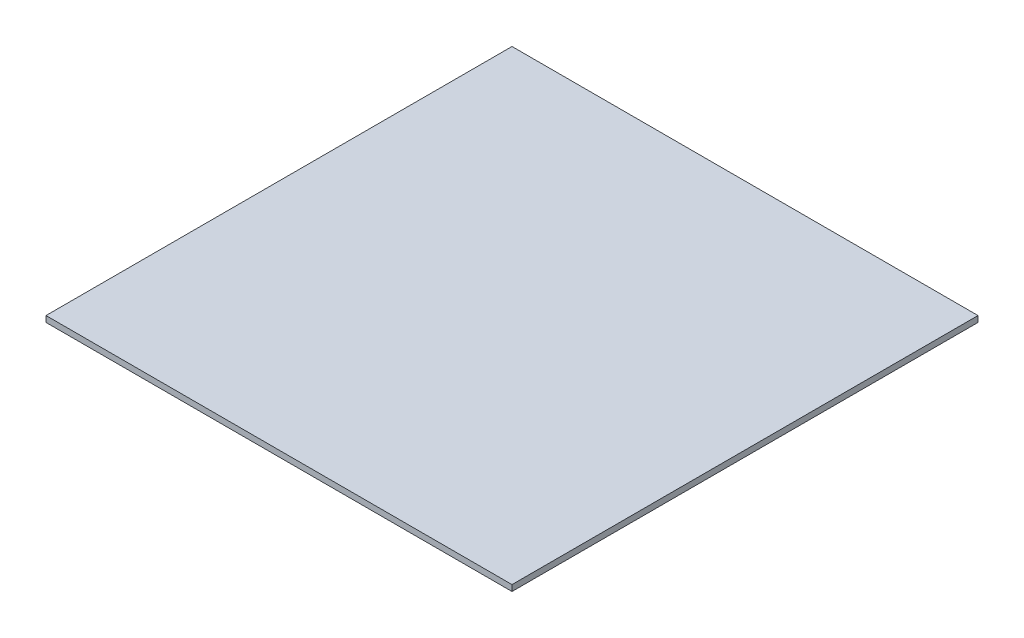
ISO-10303-21;
HEADER;
FILE_DESCRIPTION(('STEP AP214'),'2;1');
FILE_NAME('part.step','',(''),(''),'','','');
FILE_SCHEMA(('AUTOMOTIVE_DESIGN { 1 0 10303 214 1 1 1 1 }'));
ENDSEC;
DATA;
#1=APPLICATION_CONTEXT('core data for automotive mechanical design processes');
#2=APPLICATION_PROTOCOL_DEFINITION('international standard','automotive_design',2000,#1);
#3=PRODUCT_CONTEXT('',#1,'mechanical');
#4=PRODUCT('Part','Part','',(#3));
#5=PRODUCT_RELATED_PRODUCT_CATEGORY('part','',(#4));
#6=PRODUCT_DEFINITION_FORMATION('','',#4);
#7=PRODUCT_DEFINITION_CONTEXT('part definition',#1,'design');
#8=PRODUCT_DEFINITION('design','',#6,#7);
#9=PRODUCT_DEFINITION_SHAPE('','',#8);
#10=(LENGTH_UNIT() NAMED_UNIT(*) SI_UNIT(.MILLI.,.METRE.));
#11=(NAMED_UNIT(*) PLANE_ANGLE_UNIT() SI_UNIT($,.RADIAN.));
#12=(NAMED_UNIT(*) SI_UNIT($,.STERADIAN.) SOLID_ANGLE_UNIT());
#13=UNCERTAINTY_MEASURE_WITH_UNIT(LENGTH_MEASURE(1.E-05),#10,'distance_accuracy_value','');
#14=(GEOMETRIC_REPRESENTATION_CONTEXT(3) GLOBAL_UNCERTAINTY_ASSIGNED_CONTEXT((#13)) GLOBAL_UNIT_ASSIGNED_CONTEXT((#10,
#11,#12)) REPRESENTATION_CONTEXT('',''));
#15=CARTESIAN_POINT('',(0.,0.,0.));
#16=DIRECTION('',(0.,0.,1.));
#17=DIRECTION('',(1.,0.,0.));
#18=AXIS2_PLACEMENT_3D('',#15,#16,#17);
#19=CARTESIAN_POINT('',(155.,4.,-155.));
#20=DIRECTION('',(-1.,0.,0.));
#21=DIRECTION('',(0.,0.,1.));
#22=AXIS2_PLACEMENT_3D('',#19,#20,#21);
#23=PLANE('',#22);
#24=DIRECTION('',(0.,0.,-1.));
#25=VECTOR('',#24,1.);
#26=CARTESIAN_POINT('',(155.,0.,-155.));
#27=LINE('',#26,#25);
#28=CARTESIAN_POINT('',(155.,0.,155.));
#29=VERTEX_POINT('',#28);
#30=CARTESIAN_POINT('',(155.,0.,-155.));
#31=VERTEX_POINT('',#30);
#32=EDGE_CURVE('E99',#29,#31,#27,.T.);
#33=ORIENTED_EDGE('',*,*,#32,.T.);
#34=DIRECTION('',(0.,-1.,0.));
#35=VECTOR('',#34,1.);
#36=CARTESIAN_POINT('',(155.,4.,-155.));
#37=LINE('',#36,#35);
#38=CARTESIAN_POINT('',(155.,4.,-155.));
#39=VERTEX_POINT('',#38);
#40=EDGE_CURVE('E11',#39,#31,#37,.T.);
#41=ORIENTED_EDGE('',*,*,#40,.F.);
#42=DIRECTION('',(0.,0.,-1.));
#43=VECTOR('',#42,1.);
#44=CARTESIAN_POINT('',(155.,4.,-155.));
#45=LINE('',#44,#43);
#46=CARTESIAN_POINT('',(155.,4.,155.));
#47=VERTEX_POINT('',#46);
#48=EDGE_CURVE('E87',#47,#39,#45,.T.);
#49=ORIENTED_EDGE('',*,*,#48,.F.);
#50=DIRECTION('',(0.,-1.,0.));
#51=VECTOR('',#50,1.);
#52=CARTESIAN_POINT('',(155.,4.,155.));
#53=LINE('',#52,#51);
#54=EDGE_CURVE('E95',#47,#29,#53,.T.);
#55=ORIENTED_EDGE('',*,*,#54,.T.);
#56=EDGE_LOOP('',(#33,#41,#49,#55));
#57=FACE_BOUND('',#56,.T.);
#58=ADVANCED_FACE('F36',(#57),#23,.F.);
#59=CARTESIAN_POINT('',(-155.,4.,-155.));
#60=DIRECTION('',(0.,0.,1.));
#61=DIRECTION('',(1.,0.,0.));
#62=AXIS2_PLACEMENT_3D('',#59,#60,#61);
#63=PLANE('',#62);
#64=DIRECTION('',(-1.,0.,0.));
#65=VECTOR('',#64,1.);
#66=CARTESIAN_POINT('',(-155.,0.,-155.));
#67=LINE('',#66,#65);
#68=CARTESIAN_POINT('',(-155.,0.,-155.));
#69=VERTEX_POINT('',#68);
#70=EDGE_CURVE('E91',#31,#69,#67,.T.);
#71=ORIENTED_EDGE('',*,*,#70,.T.);
#72=DIRECTION('',(0.,-1.,0.));
#73=VECTOR('',#72,1.);
#74=CARTESIAN_POINT('',(-155.,4.,-155.));
#75=LINE('',#74,#73);
#76=CARTESIAN_POINT('',(-155.,4.,-155.));
#77=VERTEX_POINT('',#76);
#78=EDGE_CURVE('E44',#77,#69,#75,.T.);
#79=ORIENTED_EDGE('',*,*,#78,.F.);
#80=DIRECTION('',(-1.,0.,0.));
#81=VECTOR('',#80,1.);
#82=CARTESIAN_POINT('',(-155.,4.,-155.));
#83=LINE('',#82,#81);
#84=EDGE_CURVE('E82',#39,#77,#83,.T.);
#85=ORIENTED_EDGE('',*,*,#84,.F.);
#86=ORIENTED_EDGE('',*,*,#40,.T.);
#87=EDGE_LOOP('',(#71,#79,#85,#86));
#88=FACE_BOUND('',#87,.T.);
#89=ADVANCED_FACE('F90',(#88),#63,.F.);
#90=CARTESIAN_POINT('',(-155.,4.,-155.));
#91=DIRECTION('',(1.,0.,0.));
#92=DIRECTION('',(0.,0.,-1.));
#93=AXIS2_PLACEMENT_3D('',#90,#91,#92);
#94=PLANE('',#93);
#95=DIRECTION('',(0.,0.,1.));
#96=VECTOR('',#95,1.);
#97=CARTESIAN_POINT('',(-155.,0.,-155.));
#98=LINE('',#97,#96);
#99=CARTESIAN_POINT('',(-155.,0.,155.));
#100=VERTEX_POINT('',#99);
#101=EDGE_CURVE('E69',#69,#100,#98,.T.);
#102=ORIENTED_EDGE('',*,*,#101,.T.);
#103=DIRECTION('',(0.,-1.,0.));
#104=VECTOR('',#103,1.);
#105=CARTESIAN_POINT('',(-155.,4.,155.));
#106=LINE('',#105,#104);
#107=CARTESIAN_POINT('',(-155.,4.,155.));
#108=VERTEX_POINT('',#107);
#109=EDGE_CURVE('E92',#108,#100,#106,.T.);
#110=ORIENTED_EDGE('',*,*,#109,.F.);
#111=DIRECTION('',(0.,0.,1.));
#112=VECTOR('',#111,1.);
#113=CARTESIAN_POINT('',(-155.,4.,-155.));
#114=LINE('',#113,#112);
#115=EDGE_CURVE('E85',#77,#108,#114,.T.);
#116=ORIENTED_EDGE('',*,*,#115,.F.);
#117=ORIENTED_EDGE('',*,*,#78,.T.);
#118=EDGE_LOOP('',(#102,#110,#116,#117));
#119=FACE_BOUND('',#118,.T.);
#120=ADVANCED_FACE('F93',(#119),#94,.F.);
#121=CARTESIAN_POINT('',(-155.,4.,155.));
#122=DIRECTION('',(0.,0.,-1.));
#123=DIRECTION('',(-1.,0.,0.));
#124=AXIS2_PLACEMENT_3D('',#121,#122,#123);
#125=PLANE('',#124);
#126=DIRECTION('',(1.,0.,0.));
#127=VECTOR('',#126,1.);
#128=CARTESIAN_POINT('',(-155.,0.,155.));
#129=LINE('',#128,#127);
#130=EDGE_CURVE('E75',#100,#29,#129,.T.);
#131=ORIENTED_EDGE('',*,*,#130,.T.);
#132=ORIENTED_EDGE('',*,*,#54,.F.);
#133=DIRECTION('',(1.,0.,0.));
#134=VECTOR('',#133,1.);
#135=CARTESIAN_POINT('',(-155.,4.,155.));
#136=LINE('',#135,#134);
#137=EDGE_CURVE('E52',#108,#47,#136,.T.);
#138=ORIENTED_EDGE('',*,*,#137,.F.);
#139=ORIENTED_EDGE('',*,*,#109,.T.);
#140=EDGE_LOOP('',(#131,#132,#138,#139));
#141=FACE_BOUND('',#140,.T.);
#142=ADVANCED_FACE('F106',(#141),#125,.F.);
#143=CARTESIAN_POINT('',(0.,4.,0.));
#144=DIRECTION('',(0.,1.,0.));
#145=DIRECTION('',(0.,0.,1.));
#146=AXIS2_PLACEMENT_3D('',#143,#144,#145);
#147=PLANE('',#146);
#148=ORIENTED_EDGE('',*,*,#48,.T.);
#149=ORIENTED_EDGE('',*,*,#84,.T.);
#150=ORIENTED_EDGE('',*,*,#115,.T.);
#151=ORIENTED_EDGE('',*,*,#137,.T.);
#152=EDGE_LOOP('',(#148,#149,#150,#151));
#153=FACE_BOUND('',#152,.T.);
#154=ADVANCED_FACE('F83',(#153),#147,.T.);
#155=CARTESIAN_POINT('',(0.,0.,0.));
#156=DIRECTION('',(0.,1.,0.));
#157=DIRECTION('',(0.,0.,1.));
#158=AXIS2_PLACEMENT_3D('',#155,#156,#157);
#159=PLANE('',#158);
#160=ORIENTED_EDGE('',*,*,#32,.F.);
#161=ORIENTED_EDGE('',*,*,#130,.F.);
#162=ORIENTED_EDGE('',*,*,#101,.F.);
#163=ORIENTED_EDGE('',*,*,#70,.F.);
#164=EDGE_LOOP('',(#160,#161,#162,#163));
#165=FACE_BOUND('',#164,.T.);
#166=ADVANCED_FACE('F109',(#165),#159,.F.);
#167=CLOSED_SHELL('',(#58,#89,#120,#142,#154,#166));
#168=MANIFOLD_SOLID_BREP('B2',#167);
#169=ADVANCED_BREP_SHAPE_REPRESENTATION('',(#18,#168),#14);
#170=SHAPE_DEFINITION_REPRESENTATION(#9,#169);
ENDSEC;
END-ISO-10303-21;
